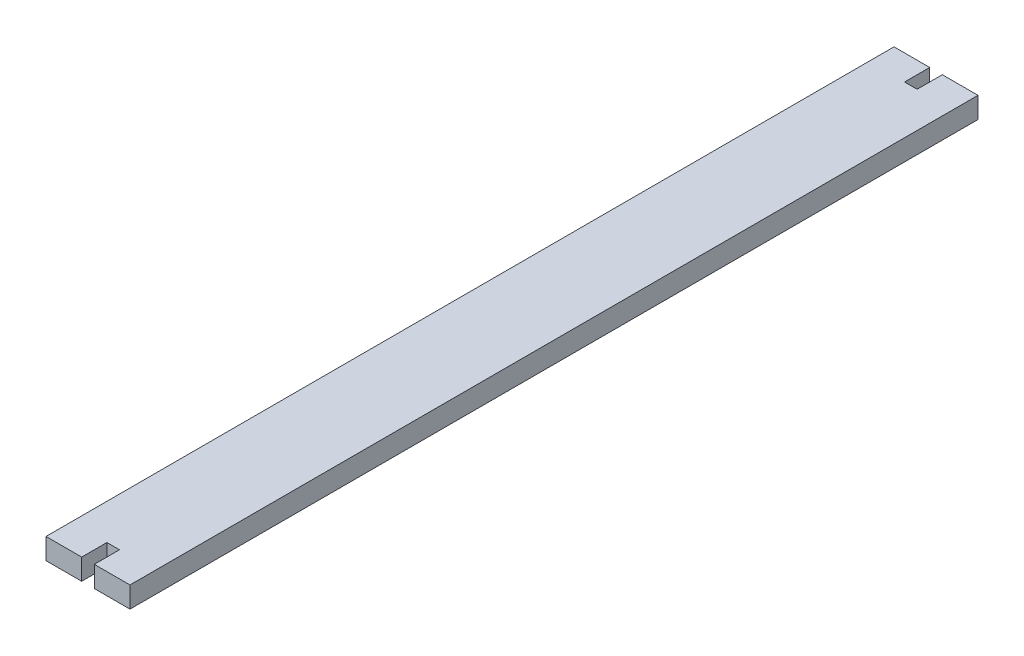
ISO-10303-21;
HEADER;
FILE_DESCRIPTION(('STEP AP214'),'2;1');
FILE_NAME('part.step','',(''),(''),'','','');
FILE_SCHEMA(('AUTOMOTIVE_DESIGN { 1 0 10303 214 1 1 1 1 }'));
ENDSEC;
DATA;
#1=APPLICATION_CONTEXT('core data for automotive mechanical design processes');
#2=APPLICATION_PROTOCOL_DEFINITION('international standard','automotive_design',2000,#1);
#3=PRODUCT_CONTEXT('',#1,'mechanical');
#4=PRODUCT('Part','Part','',(#3));
#5=PRODUCT_RELATED_PRODUCT_CATEGORY('part','',(#4));
#6=PRODUCT_DEFINITION_FORMATION('','',#4);
#7=PRODUCT_DEFINITION_CONTEXT('part definition',#1,'design');
#8=PRODUCT_DEFINITION('design','',#6,#7);
#9=PRODUCT_DEFINITION_SHAPE('','',#8);
#10=(LENGTH_UNIT() NAMED_UNIT(*) SI_UNIT(.MILLI.,.METRE.));
#11=(NAMED_UNIT(*) PLANE_ANGLE_UNIT() SI_UNIT($,.RADIAN.));
#12=(NAMED_UNIT(*) SI_UNIT($,.STERADIAN.) SOLID_ANGLE_UNIT());
#13=UNCERTAINTY_MEASURE_WITH_UNIT(LENGTH_MEASURE(1.E-05),#10,'distance_accuracy_value','');
#14=(GEOMETRIC_REPRESENTATION_CONTEXT(3) GLOBAL_UNCERTAINTY_ASSIGNED_CONTEXT((#13)) GLOBAL_UNIT_ASSIGNED_CONTEXT((#10,
#11,#12)) REPRESENTATION_CONTEXT('',''));
#15=CARTESIAN_POINT('',(0.,0.,0.));
#16=DIRECTION('',(0.,0.,1.));
#17=DIRECTION('',(1.,0.,0.));
#18=AXIS2_PLACEMENT_3D('',#15,#16,#17);
#19=CARTESIAN_POINT('',(10.,-5.,-101.));
#20=DIRECTION('',(0.,0.,-1.));
#21=DIRECTION('',(-1.,0.,0.));
#22=AXIS2_PLACEMENT_3D('',#19,#20,#21);
#23=PLANE('',#22);
#24=DIRECTION('',(0.,1.,0.));
#25=VECTOR('',#24,1.);
#26=CARTESIAN_POINT('',(-1.5,-5.,-101.));
#27=LINE('',#26,#25);
#28=CARTESIAN_POINT('',(-1.5,-5.,-101.));
#29=VERTEX_POINT('',#28);
#30=CARTESIAN_POINT('',(-1.5,0.,-101.));
#31=VERTEX_POINT('',#30);
#32=EDGE_CURVE('E174',#29,#31,#27,.T.);
#33=ORIENTED_EDGE('',*,*,#32,.F.);
#34=DIRECTION('',(-1.,0.,0.));
#35=VECTOR('',#34,1.);
#36=CARTESIAN_POINT('',(10.,-5.,-101.));
#37=LINE('',#36,#35);
#38=CARTESIAN_POINT('',(-10.,-5.,-101.));
#39=VERTEX_POINT('',#38);
#40=EDGE_CURVE('E159',#29,#39,#37,.T.);
#41=ORIENTED_EDGE('',*,*,#40,.T.);
#42=DIRECTION('',(0.,1.,0.));
#43=VECTOR('',#42,1.);
#44=CARTESIAN_POINT('',(-10.,-5.,-101.));
#45=LINE('',#44,#43);
#46=CARTESIAN_POINT('',(-10.,0.,-101.));
#47=VERTEX_POINT('',#46);
#48=EDGE_CURVE('E11',#39,#47,#45,.T.);
#49=ORIENTED_EDGE('',*,*,#48,.T.);
#50=DIRECTION('',(-1.,0.,0.));
#51=VECTOR('',#50,1.);
#52=CARTESIAN_POINT('',(10.,0.,-101.));
#53=LINE('',#52,#51);
#54=EDGE_CURVE('E247',#31,#47,#53,.T.);
#55=ORIENTED_EDGE('',*,*,#54,.F.);
#56=EDGE_LOOP('',(#33,#41,#49,#55));
#57=FACE_BOUND('',#56,.T.);
#58=ADVANCED_FACE('F45',(#57),#23,.T.);
#59=CARTESIAN_POINT('',(10.,-5.,101.));
#60=DIRECTION('',(0.,0.,1.));
#61=DIRECTION('',(1.,0.,0.));
#62=AXIS2_PLACEMENT_3D('',#59,#60,#61);
#63=PLANE('',#62);
#64=DIRECTION('',(0.,1.,0.));
#65=VECTOR('',#64,1.);
#66=CARTESIAN_POINT('',(-1.5,-5.,101.));
#67=LINE('',#66,#65);
#68=CARTESIAN_POINT('',(-1.5,-5.,101.));
#69=VERTEX_POINT('',#68);
#70=CARTESIAN_POINT('',(-1.5,0.,101.));
#71=VERTEX_POINT('',#70);
#72=EDGE_CURVE('E184',#69,#71,#67,.T.);
#73=ORIENTED_EDGE('',*,*,#72,.T.);
#74=DIRECTION('',(1.,0.,0.));
#75=VECTOR('',#74,1.);
#76=CARTESIAN_POINT('',(10.,0.,101.));
#77=LINE('',#76,#75);
#78=CARTESIAN_POINT('',(-10.,0.,101.));
#79=VERTEX_POINT('',#78);
#80=EDGE_CURVE('E239',#79,#71,#77,.T.);
#81=ORIENTED_EDGE('',*,*,#80,.F.);
#82=DIRECTION('',(0.,1.,0.));
#83=VECTOR('',#82,1.);
#84=CARTESIAN_POINT('',(-10.,-5.,101.));
#85=LINE('',#84,#83);
#86=CARTESIAN_POINT('',(-10.,-5.,101.));
#87=VERTEX_POINT('',#86);
#88=EDGE_CURVE('E49',#87,#79,#85,.T.);
#89=ORIENTED_EDGE('',*,*,#88,.F.);
#90=DIRECTION('',(1.,0.,0.));
#91=VECTOR('',#90,1.);
#92=CARTESIAN_POINT('',(10.,-5.,101.));
#93=LINE('',#92,#91);
#94=EDGE_CURVE('E223',#87,#69,#93,.T.);
#95=ORIENTED_EDGE('',*,*,#94,.T.);
#96=EDGE_LOOP('',(#73,#81,#89,#95));
#97=FACE_BOUND('',#96,.T.);
#98=ADVANCED_FACE('F266',(#97),#63,.T.);
#99=CARTESIAN_POINT('',(-10.,-5.,101.));
#100=DIRECTION('',(-1.,0.,0.));
#101=DIRECTION('',(0.,0.,1.));
#102=AXIS2_PLACEMENT_3D('',#99,#100,#101);
#103=PLANE('',#102);
#104=DIRECTION('',(0.,0.,1.));
#105=VECTOR('',#104,1.);
#106=CARTESIAN_POINT('',(-10.,0.,101.));
#107=LINE('',#106,#105);
#108=EDGE_CURVE('E177',#47,#79,#107,.T.);
#109=ORIENTED_EDGE('',*,*,#108,.F.);
#110=ORIENTED_EDGE('',*,*,#48,.F.);
#111=DIRECTION('',(0.,0.,1.));
#112=VECTOR('',#111,1.);
#113=CARTESIAN_POINT('',(-10.,-5.,101.));
#114=LINE('',#113,#112);
#115=EDGE_CURVE('E217',#39,#87,#114,.T.);
#116=ORIENTED_EDGE('',*,*,#115,.T.);
#117=ORIENTED_EDGE('',*,*,#88,.T.);
#118=EDGE_LOOP('',(#109,#110,#116,#117));
#119=FACE_BOUND('',#118,.T.);
#120=ADVANCED_FACE('F47',(#119),#103,.T.);
#121=DIRECTION('',(0.,1.,0.));
#122=VECTOR('',#121,1.);
#123=CARTESIAN_POINT('',(1.5,-5.,-101.));
#124=LINE('',#123,#122);
#125=CARTESIAN_POINT('',(1.5,-5.,-101.));
#126=VERTEX_POINT('',#125);
#127=CARTESIAN_POINT('',(1.5,0.,-101.));
#128=VERTEX_POINT('',#127);
#129=EDGE_CURVE('E178',#126,#128,#124,.T.);
#130=ORIENTED_EDGE('',*,*,#129,.T.);
#131=CARTESIAN_POINT('',(10.,0.,-101.));
#132=VERTEX_POINT('',#131);
#133=EDGE_CURVE('E222',#132,#128,#53,.T.);
#134=ORIENTED_EDGE('',*,*,#133,.F.);
#135=DIRECTION('',(0.,1.,0.));
#136=VECTOR('',#135,1.);
#137=CARTESIAN_POINT('',(10.,-5.,-101.));
#138=LINE('',#137,#136);
#139=CARTESIAN_POINT('',(10.,-5.,-101.));
#140=VERTEX_POINT('',#139);
#141=EDGE_CURVE('E55',#140,#132,#138,.T.);
#142=ORIENTED_EDGE('',*,*,#141,.F.);
#143=EDGE_CURVE('E231',#140,#126,#37,.T.);
#144=ORIENTED_EDGE('',*,*,#143,.T.);
#145=EDGE_LOOP('',(#130,#134,#142,#144));
#146=FACE_BOUND('',#145,.T.);
#147=ADVANCED_FACE('F293',(#146),#23,.T.);
#148=CARTESIAN_POINT('',(10.,-5.,101.));
#149=DIRECTION('',(1.,0.,0.));
#150=DIRECTION('',(0.,0.,-1.));
#151=AXIS2_PLACEMENT_3D('',#148,#149,#150);
#152=PLANE('',#151);
#153=DIRECTION('',(0.,0.,-1.));
#154=VECTOR('',#153,1.);
#155=CARTESIAN_POINT('',(10.,0.,101.));
#156=LINE('',#155,#154);
#157=CARTESIAN_POINT('',(10.,0.,101.));
#158=VERTEX_POINT('',#157);
#159=EDGE_CURVE('E243',#158,#132,#156,.T.);
#160=ORIENTED_EDGE('',*,*,#159,.F.);
#161=DIRECTION('',(0.,1.,0.));
#162=VECTOR('',#161,1.);
#163=CARTESIAN_POINT('',(10.,-5.,101.));
#164=LINE('',#163,#162);
#165=CARTESIAN_POINT('',(10.,-5.,101.));
#166=VERTEX_POINT('',#165);
#167=EDGE_CURVE('E252',#166,#158,#164,.T.);
#168=ORIENTED_EDGE('',*,*,#167,.F.);
#169=DIRECTION('',(0.,0.,-1.));
#170=VECTOR('',#169,1.);
#171=CARTESIAN_POINT('',(10.,-5.,101.));
#172=LINE('',#171,#170);
#173=EDGE_CURVE('E227',#166,#140,#172,.T.);
#174=ORIENTED_EDGE('',*,*,#173,.T.);
#175=ORIENTED_EDGE('',*,*,#141,.T.);
#176=EDGE_LOOP('',(#160,#168,#174,#175));
#177=FACE_BOUND('',#176,.T.);
#178=ADVANCED_FACE('F302',(#177),#152,.T.);
#179=DIRECTION('',(0.,1.,0.));
#180=VECTOR('',#179,1.);
#181=CARTESIAN_POINT('',(1.49999999999999,-5.,101.));
#182=LINE('',#181,#180);
#183=CARTESIAN_POINT('',(1.49999999999999,-5.,101.));
#184=VERTEX_POINT('',#183);
#185=CARTESIAN_POINT('',(1.49999999999999,0.,101.));
#186=VERTEX_POINT('',#185);
#187=EDGE_CURVE('E71',#184,#186,#182,.T.);
#188=ORIENTED_EDGE('',*,*,#187,.F.);
#189=EDGE_CURVE('E221',#184,#166,#93,.T.);
#190=ORIENTED_EDGE('',*,*,#189,.T.);
#191=ORIENTED_EDGE('',*,*,#167,.T.);
#192=EDGE_CURVE('E238',#186,#158,#77,.T.);
#193=ORIENTED_EDGE('',*,*,#192,.F.);
#194=EDGE_LOOP('',(#188,#190,#191,#193));
#195=FACE_BOUND('',#194,.T.);
#196=ADVANCED_FACE('F298',(#195),#63,.T.);
#197=CARTESIAN_POINT('',(0.,-5.,0.));
#198=DIRECTION('',(0.,1.,0.));
#199=DIRECTION('',(0.,0.,1.));
#200=AXIS2_PLACEMENT_3D('',#197,#198,#199);
#201=PLANE('',#200);
#202=ORIENTED_EDGE('',*,*,#40,.F.);
#203=DIRECTION('',(0.,0.,1.));
#204=VECTOR('',#203,1.);
#205=CARTESIAN_POINT('',(-1.5,-5.,-95.));
#206=LINE('',#205,#204);
#207=CARTESIAN_POINT('',(-1.5,-5.,-95.));
#208=VERTEX_POINT('',#207);
#209=EDGE_CURVE('E139',#29,#208,#206,.T.);
#210=ORIENTED_EDGE('',*,*,#209,.T.);
#211=DIRECTION('',(1.,0.,0.));
#212=VECTOR('',#211,1.);
#213=CARTESIAN_POINT('',(1.5,-5.,-95.));
#214=LINE('',#213,#212);
#215=CARTESIAN_POINT('',(1.5,-5.,-95.));
#216=VERTEX_POINT('',#215);
#217=EDGE_CURVE('E149',#208,#216,#214,.T.);
#218=ORIENTED_EDGE('',*,*,#217,.T.);
#219=DIRECTION('',(0.,0.,-1.));
#220=VECTOR('',#219,1.);
#221=CARTESIAN_POINT('',(1.5,-5.,-95.));
#222=LINE('',#221,#220);
#223=EDGE_CURVE('E146',#216,#126,#222,.T.);
#224=ORIENTED_EDGE('',*,*,#223,.T.);
#225=ORIENTED_EDGE('',*,*,#143,.F.);
#226=ORIENTED_EDGE('',*,*,#173,.F.);
#227=ORIENTED_EDGE('',*,*,#189,.F.);
#228=DIRECTION('',(0.,0.,-1.));
#229=VECTOR('',#228,1.);
#230=CARTESIAN_POINT('',(1.49999999999999,-5.,95.));
#231=LINE('',#230,#229);
#232=CARTESIAN_POINT('',(1.49999999999999,-5.,95.));
#233=VERTEX_POINT('',#232);
#234=EDGE_CURVE('E210',#184,#233,#231,.T.);
#235=ORIENTED_EDGE('',*,*,#234,.T.);
#236=DIRECTION('',(-1.,0.,0.));
#237=VECTOR('',#236,1.);
#238=CARTESIAN_POINT('',(1.49999999999999,-5.,95.));
#239=LINE('',#238,#237);
#240=CARTESIAN_POINT('',(-1.5,-5.,95.));
#241=VERTEX_POINT('',#240);
#242=EDGE_CURVE('E188',#233,#241,#239,.T.);
#243=ORIENTED_EDGE('',*,*,#242,.T.);
#244=DIRECTION('',(0.,0.,1.));
#245=VECTOR('',#244,1.);
#246=CARTESIAN_POINT('',(-1.5,-5.,95.));
#247=LINE('',#246,#245);
#248=EDGE_CURVE('E202',#241,#69,#247,.T.);
#249=ORIENTED_EDGE('',*,*,#248,.T.);
#250=ORIENTED_EDGE('',*,*,#94,.F.);
#251=ORIENTED_EDGE('',*,*,#115,.F.);
#252=EDGE_LOOP('',(#202,#210,#218,#224,#225,#226,#227,#235,#243,#249,#250,#251));
#253=FACE_BOUND('',#252,.T.);
#254=ADVANCED_FACE('F157',(#253),#201,.F.);
#255=CARTESIAN_POINT('',(0.,0.,0.));
#256=DIRECTION('',(0.,1.,0.));
#257=DIRECTION('',(0.,0.,1.));
#258=AXIS2_PLACEMENT_3D('',#255,#256,#257);
#259=PLANE('',#258);
#260=DIRECTION('',(0.,0.,1.));
#261=VECTOR('',#260,1.);
#262=CARTESIAN_POINT('',(-1.5,0.,-95.));
#263=LINE('',#262,#261);
#264=CARTESIAN_POINT('',(-1.5,0.,-95.));
#265=VERTEX_POINT('',#264);
#266=EDGE_CURVE('E63',#31,#265,#263,.T.);
#267=ORIENTED_EDGE('',*,*,#266,.F.);
#268=ORIENTED_EDGE('',*,*,#54,.T.);
#269=ORIENTED_EDGE('',*,*,#108,.T.);
#270=ORIENTED_EDGE('',*,*,#80,.T.);
#271=DIRECTION('',(0.,0.,1.));
#272=VECTOR('',#271,1.);
#273=CARTESIAN_POINT('',(-1.5,0.,95.));
#274=LINE('',#273,#272);
#275=CARTESIAN_POINT('',(-1.5,0.,95.));
#276=VERTEX_POINT('',#275);
#277=EDGE_CURVE('E171',#276,#71,#274,.T.);
#278=ORIENTED_EDGE('',*,*,#277,.F.);
#279=DIRECTION('',(-1.,0.,0.));
#280=VECTOR('',#279,1.);
#281=CARTESIAN_POINT('',(1.49999999999999,0.,95.));
#282=LINE('',#281,#280);
#283=CARTESIAN_POINT('',(1.49999999999999,0.,95.));
#284=VERTEX_POINT('',#283);
#285=EDGE_CURVE('E197',#284,#276,#282,.T.);
#286=ORIENTED_EDGE('',*,*,#285,.F.);
#287=DIRECTION('',(0.,0.,-1.));
#288=VECTOR('',#287,1.);
#289=CARTESIAN_POINT('',(1.49999999999999,0.,95.));
#290=LINE('',#289,#288);
#291=EDGE_CURVE('E201',#186,#284,#290,.T.);
#292=ORIENTED_EDGE('',*,*,#291,.F.);
#293=ORIENTED_EDGE('',*,*,#192,.T.);
#294=ORIENTED_EDGE('',*,*,#159,.T.);
#295=ORIENTED_EDGE('',*,*,#133,.T.);
#296=DIRECTION('',(0.,0.,-1.));
#297=VECTOR('',#296,1.);
#298=CARTESIAN_POINT('',(1.5,0.,-95.));
#299=LINE('',#298,#297);
#300=CARTESIAN_POINT('',(1.5,0.,-95.));
#301=VERTEX_POINT('',#300);
#302=EDGE_CURVE('E161',#301,#128,#299,.T.);
#303=ORIENTED_EDGE('',*,*,#302,.F.);
#304=DIRECTION('',(1.,0.,0.));
#305=VECTOR('',#304,1.);
#306=CARTESIAN_POINT('',(1.5,0.,-95.));
#307=LINE('',#306,#305);
#308=EDGE_CURVE('E164',#265,#301,#307,.T.);
#309=ORIENTED_EDGE('',*,*,#308,.F.);
#310=EDGE_LOOP('',(#267,#268,#269,#270,#278,#286,#292,#293,#294,#295,#303,#309));
#311=FACE_BOUND('',#310,.T.);
#312=ADVANCED_FACE('F269',(#311),#259,.T.);
#313=CARTESIAN_POINT('',(-1.5,-5.,95.));
#314=DIRECTION('',(-1.,0.,0.));
#315=DIRECTION('',(0.,0.,1.));
#316=AXIS2_PLACEMENT_3D('',#313,#314,#315);
#317=PLANE('',#316);
#318=ORIENTED_EDGE('',*,*,#277,.T.);
#319=ORIENTED_EDGE('',*,*,#72,.F.);
#320=ORIENTED_EDGE('',*,*,#248,.F.);
#321=DIRECTION('',(0.,1.,0.));
#322=VECTOR('',#321,1.);
#323=CARTESIAN_POINT('',(-1.5,-5.,95.));
#324=LINE('',#323,#322);
#325=EDGE_CURVE('E194',#241,#276,#324,.T.);
#326=ORIENTED_EDGE('',*,*,#325,.T.);
#327=EDGE_LOOP('',(#318,#319,#320,#326));
#328=FACE_BOUND('',#327,.T.);
#329=ADVANCED_FACE('F276',(#328),#317,.F.);
#330=CARTESIAN_POINT('',(1.49999999999999,-5.,95.));
#331=DIRECTION('',(0.,0.,-1.));
#332=DIRECTION('',(-1.,0.,0.));
#333=AXIS2_PLACEMENT_3D('',#330,#331,#332);
#334=PLANE('',#333);
#335=ORIENTED_EDGE('',*,*,#285,.T.);
#336=ORIENTED_EDGE('',*,*,#325,.F.);
#337=ORIENTED_EDGE('',*,*,#242,.F.);
#338=DIRECTION('',(0.,1.,0.));
#339=VECTOR('',#338,1.);
#340=CARTESIAN_POINT('',(1.49999999999999,-5.,95.));
#341=LINE('',#340,#339);
#342=EDGE_CURVE('E191',#233,#284,#341,.T.);
#343=ORIENTED_EDGE('',*,*,#342,.T.);
#344=EDGE_LOOP('',(#335,#336,#337,#343));
#345=FACE_BOUND('',#344,.T.);
#346=ADVANCED_FACE('F279',(#345),#334,.F.);
#347=CARTESIAN_POINT('',(1.49999999999999,-5.,95.));
#348=DIRECTION('',(1.,0.,0.));
#349=DIRECTION('',(0.,0.,-1.));
#350=AXIS2_PLACEMENT_3D('',#347,#348,#349);
#351=PLANE('',#350);
#352=ORIENTED_EDGE('',*,*,#291,.T.);
#353=ORIENTED_EDGE('',*,*,#342,.F.);
#354=ORIENTED_EDGE('',*,*,#234,.F.);
#355=ORIENTED_EDGE('',*,*,#187,.T.);
#356=EDGE_LOOP('',(#352,#353,#354,#355));
#357=FACE_BOUND('',#356,.T.);
#358=ADVANCED_FACE('F280',(#357),#351,.F.);
#359=CARTESIAN_POINT('',(-1.5,-5.,-95.));
#360=DIRECTION('',(-1.,0.,0.));
#361=DIRECTION('',(0.,0.,1.));
#362=AXIS2_PLACEMENT_3D('',#359,#360,#361);
#363=PLANE('',#362);
#364=ORIENTED_EDGE('',*,*,#266,.T.);
#365=DIRECTION('',(0.,1.,0.));
#366=VECTOR('',#365,1.);
#367=CARTESIAN_POINT('',(-1.5,-5.,-95.));
#368=LINE('',#367,#366);
#369=EDGE_CURVE('E135',#208,#265,#368,.T.);
#370=ORIENTED_EDGE('',*,*,#369,.F.);
#371=ORIENTED_EDGE('',*,*,#209,.F.);
#372=ORIENTED_EDGE('',*,*,#32,.T.);
#373=EDGE_LOOP('',(#364,#370,#371,#372));
#374=FACE_BOUND('',#373,.T.);
#375=ADVANCED_FACE('F137',(#374),#363,.F.);
#376=CARTESIAN_POINT('',(1.5,-5.,-95.));
#377=DIRECTION('',(1.,0.,0.));
#378=DIRECTION('',(0.,0.,-1.));
#379=AXIS2_PLACEMENT_3D('',#376,#377,#378);
#380=PLANE('',#379);
#381=ORIENTED_EDGE('',*,*,#302,.T.);
#382=ORIENTED_EDGE('',*,*,#129,.F.);
#383=ORIENTED_EDGE('',*,*,#223,.F.);
#384=DIRECTION('',(0.,1.,0.));
#385=VECTOR('',#384,1.);
#386=CARTESIAN_POINT('',(1.5,-5.,-95.));
#387=LINE('',#386,#385);
#388=EDGE_CURVE('E145',#216,#301,#387,.T.);
#389=ORIENTED_EDGE('',*,*,#388,.T.);
#390=EDGE_LOOP('',(#381,#382,#383,#389));
#391=FACE_BOUND('',#390,.T.);
#392=ADVANCED_FACE('F287',(#391),#380,.F.);
#393=CARTESIAN_POINT('',(1.5,-5.,-95.));
#394=DIRECTION('',(0.,0.,1.));
#395=DIRECTION('',(1.,0.,0.));
#396=AXIS2_PLACEMENT_3D('',#393,#394,#395);
#397=PLANE('',#396);
#398=ORIENTED_EDGE('',*,*,#308,.T.);
#399=ORIENTED_EDGE('',*,*,#388,.F.);
#400=ORIENTED_EDGE('',*,*,#217,.F.);
#401=ORIENTED_EDGE('',*,*,#369,.T.);
#402=EDGE_LOOP('',(#398,#399,#400,#401));
#403=FACE_BOUND('',#402,.T.);
#404=ADVANCED_FACE('F150',(#403),#397,.F.);
#405=CLOSED_SHELL('',(#58,#98,#120,#147,#178,#196,#254,#312,#329,#346,#358,#375,#392,#404));
#406=MANIFOLD_SOLID_BREP('B2',#405);
#407=ADVANCED_BREP_SHAPE_REPRESENTATION('',(#18,#406),#14);
#408=SHAPE_DEFINITION_REPRESENTATION(#9,#407);
ENDSEC;
END-ISO-10303-21;
